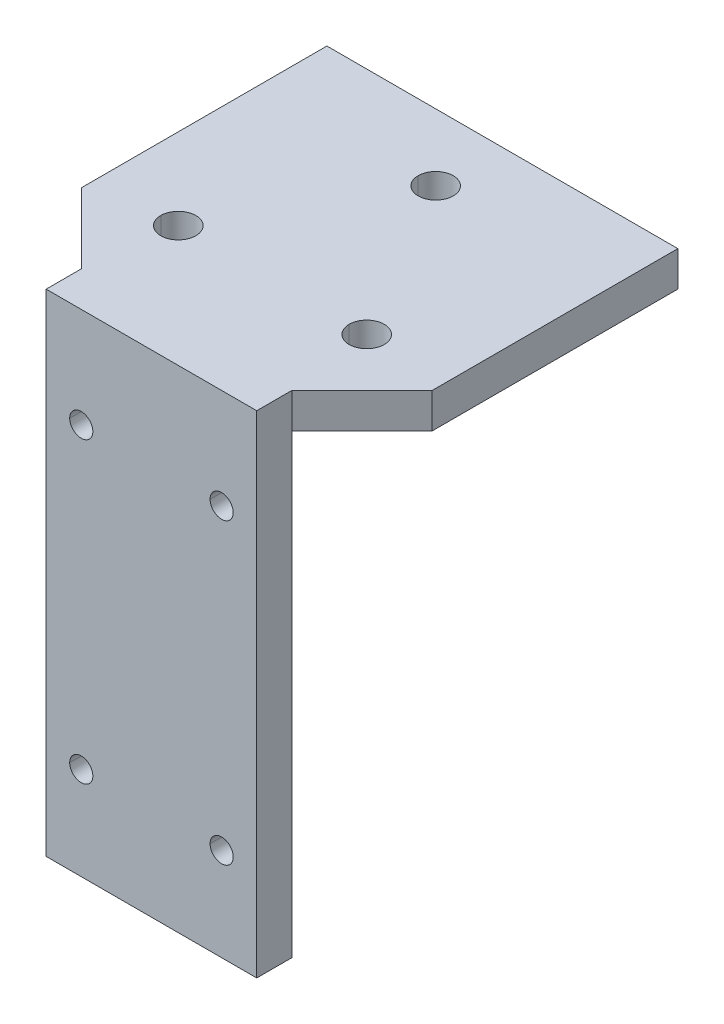
ISO-10303-21;
HEADER;
FILE_DESCRIPTION(('STEP AP214'),'2;1');
FILE_NAME('part.step','',(''),(''),'','','');
FILE_SCHEMA(('AUTOMOTIVE_DESIGN { 1 0 10303 214 1 1 1 1 }'));
ENDSEC;
DATA;
#1=APPLICATION_CONTEXT('core data for automotive mechanical design processes');
#2=APPLICATION_PROTOCOL_DEFINITION('international standard','automotive_design',2000,#1);
#3=PRODUCT_CONTEXT('',#1,'mechanical');
#4=PRODUCT('Part','Part','',(#3));
#5=PRODUCT_RELATED_PRODUCT_CATEGORY('part','',(#4));
#6=PRODUCT_DEFINITION_FORMATION('','',#4);
#7=PRODUCT_DEFINITION_CONTEXT('part definition',#1,'design');
#8=PRODUCT_DEFINITION('design','',#6,#7);
#9=PRODUCT_DEFINITION_SHAPE('','',#8);
#10=(LENGTH_UNIT() NAMED_UNIT(*) SI_UNIT(.MILLI.,.METRE.));
#11=(NAMED_UNIT(*) PLANE_ANGLE_UNIT() SI_UNIT($,.RADIAN.));
#12=(NAMED_UNIT(*) SI_UNIT($,.STERADIAN.) SOLID_ANGLE_UNIT());
#13=UNCERTAINTY_MEASURE_WITH_UNIT(LENGTH_MEASURE(1.E-05),#10,'distance_accuracy_value','');
#14=(GEOMETRIC_REPRESENTATION_CONTEXT(3) GLOBAL_UNCERTAINTY_ASSIGNED_CONTEXT((#13)) GLOBAL_UNIT_ASSIGNED_CONTEXT((#10,
#11,#12)) REPRESENTATION_CONTEXT('',''));
#15=CARTESIAN_POINT('',(0.,0.,0.));
#16=DIRECTION('',(0.,0.,1.));
#17=DIRECTION('',(1.,0.,0.));
#18=AXIS2_PLACEMENT_3D('',#15,#16,#17);
#19=CARTESIAN_POINT('',(0.,0.,0.));
#20=DIRECTION('',(0.,1.,0.));
#21=DIRECTION('',(1.,0.,0.));
#22=AXIS2_PLACEMENT_3D('',#19,#20,#21);
#23=PLANE('',#22);
#24=DIRECTION('',(-1.,0.,0.));
#25=VECTOR('',#24,1.);
#26=CARTESIAN_POINT('',(15.,0.,20.));
#27=LINE('',#26,#25);
#28=CARTESIAN_POINT('',(15.,0.,20.));
#29=VERTEX_POINT('',#28);
#30=CARTESIAN_POINT('',(-15.,0.,20.));
#31=VERTEX_POINT('',#30);
#32=EDGE_CURVE('E11',#29,#31,#27,.T.);
#33=ORIENTED_EDGE('',*,*,#32,.T.);
#34=DIRECTION('',(-0.707106781186548,0.,-0.707106781186548));
#35=VECTOR('',#34,1.);
#36=CARTESIAN_POINT('',(-15.,0.,20.));
#37=LINE('',#36,#35);
#38=CARTESIAN_POINT('',(-25.,0.,10.));
#39=VERTEX_POINT('',#38);
#40=EDGE_CURVE('E27',#31,#39,#37,.T.);
#41=ORIENTED_EDGE('',*,*,#40,.T.);
#42=DIRECTION('',(0.,0.,-1.));
#43=VECTOR('',#42,1.);
#44=CARTESIAN_POINT('',(-25.,0.,10.));
#45=LINE('',#44,#43);
#46=CARTESIAN_POINT('',(-25.,0.,-25.));
#47=VERTEX_POINT('',#46);
#48=EDGE_CURVE('E230',#39,#47,#45,.T.);
#49=ORIENTED_EDGE('',*,*,#48,.T.);
#50=DIRECTION('',(-1.,0.,0.));
#51=VECTOR('',#50,1.);
#52=CARTESIAN_POINT('',(25.,0.,-25.));
#53=LINE('',#52,#51);
#54=CARTESIAN_POINT('',(25.,0.,-25.));
#55=VERTEX_POINT('',#54);
#56=EDGE_CURVE('E296',#55,#47,#53,.T.);
#57=ORIENTED_EDGE('',*,*,#56,.F.);
#58=DIRECTION('',(0.,0.,1.));
#59=VECTOR('',#58,1.);
#60=CARTESIAN_POINT('',(25.,0.,-25.));
#61=LINE('',#60,#59);
#62=CARTESIAN_POINT('',(25.,0.,10.));
#63=VERTEX_POINT('',#62);
#64=EDGE_CURVE('E313',#55,#63,#61,.T.);
#65=ORIENTED_EDGE('',*,*,#64,.T.);
#66=DIRECTION('',(-0.707106781186548,0.,0.707106781186548));
#67=VECTOR('',#66,1.);
#68=CARTESIAN_POINT('',(25.,0.,10.));
#69=LINE('',#68,#67);
#70=EDGE_CURVE('E266',#63,#29,#69,.T.);
#71=ORIENTED_EDGE('',*,*,#70,.T.);
#72=EDGE_LOOP('',(#33,#41,#49,#57,#65,#71));
#73=FACE_BOUND('',#72,.T.);
#74=CARTESIAN_POINT('',(13.42339375866,0.,7.75));
#75=DIRECTION('',(0.,-1.,0.));
#76=DIRECTION('',(1.,0.,0.));
#77=AXIS2_PLACEMENT_3D('',#74,#75,#76);
#78=CIRCLE('',#77,2.5);
#79=CARTESIAN_POINT('',(15.92339375866,0.,7.75));
#80=VERTEX_POINT('',#79);
#81=CARTESIAN_POINT('',(10.92339375866,0.,7.75));
#82=VERTEX_POINT('',#81);
#83=EDGE_CURVE('E289',#80,#82,#78,.T.);
#84=ORIENTED_EDGE('',*,*,#83,.F.);
#85=CARTESIAN_POINT('',(13.42339375866,0.,7.75));
#86=DIRECTION('',(0.,-1.,0.));
#87=DIRECTION('',(-1.,0.,0.));
#88=AXIS2_PLACEMENT_3D('',#85,#86,#87);
#89=CIRCLE('',#88,2.5);
#90=EDGE_CURVE('E348',#82,#80,#89,.T.);
#91=ORIENTED_EDGE('',*,*,#90,.F.);
#92=EDGE_LOOP('',(#84,#91));
#93=FACE_BOUND('',#92,.T.);
#94=CARTESIAN_POINT('',(-13.42339375866,0.,7.75));
#95=DIRECTION('',(0.,-1.,0.));
#96=DIRECTION('',(1.,0.,0.));
#97=AXIS2_PLACEMENT_3D('',#94,#95,#96);
#98=CIRCLE('',#97,2.5);
#99=CARTESIAN_POINT('',(-10.92339375866,0.,7.75));
#100=VERTEX_POINT('',#99);
#101=CARTESIAN_POINT('',(-15.92339375866,0.,7.75));
#102=VERTEX_POINT('',#101);
#103=EDGE_CURVE('E288',#100,#102,#98,.T.);
#104=ORIENTED_EDGE('',*,*,#103,.F.);
#105=CARTESIAN_POINT('',(-13.42339375866,0.,7.75));
#106=DIRECTION('',(0.,-1.,0.));
#107=DIRECTION('',(-1.,0.,0.));
#108=AXIS2_PLACEMENT_3D('',#105,#106,#107);
#109=CIRCLE('',#108,2.5);
#110=EDGE_CURVE('E257',#102,#100,#109,.T.);
#111=ORIENTED_EDGE('',*,*,#110,.F.);
#112=EDGE_LOOP('',(#104,#111));
#113=FACE_BOUND('',#112,.T.);
#114=CARTESIAN_POINT('',(0.,0.,-15.5));
#115=DIRECTION('',(0.,-1.,0.));
#116=DIRECTION('',(1.,0.,0.));
#117=AXIS2_PLACEMENT_3D('',#114,#115,#116);
#118=CIRCLE('',#117,2.5);
#119=CARTESIAN_POINT('',(2.5,0.,-15.5));
#120=VERTEX_POINT('',#119);
#121=CARTESIAN_POINT('',(-2.5,0.,-15.5));
#122=VERTEX_POINT('',#121);
#123=EDGE_CURVE('E306',#120,#122,#118,.T.);
#124=ORIENTED_EDGE('',*,*,#123,.F.);
#125=CARTESIAN_POINT('',(0.,0.,-15.5));
#126=DIRECTION('',(0.,-1.,0.));
#127=DIRECTION('',(-1.,0.,0.));
#128=AXIS2_PLACEMENT_3D('',#125,#126,#127);
#129=CIRCLE('',#128,2.5);
#130=EDGE_CURVE('E247',#122,#120,#129,.T.);
#131=ORIENTED_EDGE('',*,*,#130,.F.);
#132=EDGE_LOOP('',(#124,#131));
#133=FACE_BOUND('',#132,.T.);
#134=ADVANCED_FACE('F16',(#73,#93,#113,#133),#23,.F.);
#135=CARTESIAN_POINT('',(0.,5.775,-15.5));
#136=DIRECTION('',(0.,-1.,0.));
#137=DIRECTION('',(-1.,0.,0.));
#138=AXIS2_PLACEMENT_3D('',#135,#136,#137);
#139=CYLINDRICAL_SURFACE('',#138,2.5);
#140=DIRECTION('',(0.,-1.,0.));
#141=VECTOR('',#140,1.);
#142=CARTESIAN_POINT('',(2.5,5.,-15.5));
#143=LINE('',#142,#141);
#144=CARTESIAN_POINT('',(2.5,5.,-15.5));
#145=VERTEX_POINT('',#144);
#146=EDGE_CURVE('E251',#145,#120,#143,.T.);
#147=ORIENTED_EDGE('',*,*,#146,.F.);
#148=CARTESIAN_POINT('',(0.,5.,-15.5));
#149=DIRECTION('',(0.,-1.,0.));
#150=DIRECTION('',(-1.,0.,0.));
#151=AXIS2_PLACEMENT_3D('',#148,#149,#150);
#152=CIRCLE('',#151,2.5);
#153=CARTESIAN_POINT('',(-2.5,5.,-15.5));
#154=VERTEX_POINT('',#153);
#155=EDGE_CURVE('E334',#154,#145,#152,.T.);
#156=ORIENTED_EDGE('',*,*,#155,.F.);
#157=DIRECTION('',(0.,-1.,0.));
#158=VECTOR('',#157,1.);
#159=CARTESIAN_POINT('',(-2.5,5.,-15.5));
#160=LINE('',#159,#158);
#161=EDGE_CURVE('E250',#154,#122,#160,.T.);
#162=ORIENTED_EDGE('',*,*,#161,.T.);
#163=ORIENTED_EDGE('',*,*,#130,.T.);
#164=EDGE_LOOP('',(#147,#156,#162,#163));
#165=FACE_BOUND('',#164,.T.);
#166=ADVANCED_FACE('F505',(#165),#139,.F.);
#167=CARTESIAN_POINT('',(0.,5.775,-15.5));
#168=DIRECTION('',(0.,-1.,0.));
#169=DIRECTION('',(-1.,0.,0.));
#170=AXIS2_PLACEMENT_3D('',#167,#168,#169);
#171=CYLINDRICAL_SURFACE('',#170,2.5);
#172=ORIENTED_EDGE('',*,*,#161,.F.);
#173=CARTESIAN_POINT('',(0.,5.,-15.5));
#174=DIRECTION('',(0.,-1.,0.));
#175=DIRECTION('',(1.,0.,0.));
#176=AXIS2_PLACEMENT_3D('',#173,#174,#175);
#177=CIRCLE('',#176,2.5);
#178=EDGE_CURVE('E283',#145,#154,#177,.T.);
#179=ORIENTED_EDGE('',*,*,#178,.F.);
#180=ORIENTED_EDGE('',*,*,#146,.T.);
#181=ORIENTED_EDGE('',*,*,#123,.T.);
#182=EDGE_LOOP('',(#172,#179,#180,#181));
#183=FACE_BOUND('',#182,.T.);
#184=ADVANCED_FACE('F511',(#183),#171,.F.);
#185=CARTESIAN_POINT('',(0.,5.,0.));
#186=DIRECTION('',(0.,1.,0.));
#187=DIRECTION('',(1.,0.,0.));
#188=AXIS2_PLACEMENT_3D('',#185,#186,#187);
#189=PLANE('',#188);
#190=DIRECTION('',(0.,0.,-1.));
#191=VECTOR('',#190,1.);
#192=CARTESIAN_POINT('',(25.,5.,10.));
#193=LINE('',#192,#191);
#194=CARTESIAN_POINT('',(25.,5.,10.));
#195=VERTEX_POINT('',#194);
#196=CARTESIAN_POINT('',(25.,5.,-25.));
#197=VERTEX_POINT('',#196);
#198=EDGE_CURVE('E310',#195,#197,#193,.T.);
#199=ORIENTED_EDGE('',*,*,#198,.T.);
#200=DIRECTION('',(-1.,0.,0.));
#201=VECTOR('',#200,1.);
#202=CARTESIAN_POINT('',(25.,5.,-25.));
#203=LINE('',#202,#201);
#204=CARTESIAN_POINT('',(-25.,5.,-25.));
#205=VERTEX_POINT('',#204);
#206=EDGE_CURVE('E222',#197,#205,#203,.T.);
#207=ORIENTED_EDGE('',*,*,#206,.T.);
#208=DIRECTION('',(0.,0.,1.));
#209=VECTOR('',#208,1.);
#210=CARTESIAN_POINT('',(-25.,5.,-25.));
#211=LINE('',#210,#209);
#212=CARTESIAN_POINT('',(-25.,5.,10.));
#213=VERTEX_POINT('',#212);
#214=EDGE_CURVE('E214',#205,#213,#211,.T.);
#215=ORIENTED_EDGE('',*,*,#214,.T.);
#216=DIRECTION('',(0.707106781186548,0.,0.707106781186548));
#217=VECTOR('',#216,1.);
#218=CARTESIAN_POINT('',(-25.,5.,10.));
#219=LINE('',#218,#217);
#220=CARTESIAN_POINT('',(-15.,5.,20.));
#221=VERTEX_POINT('',#220);
#222=EDGE_CURVE('E205',#213,#221,#219,.T.);
#223=ORIENTED_EDGE('',*,*,#222,.T.);
#224=DIRECTION('',(0.,0.,1.));
#225=VECTOR('',#224,1.);
#226=CARTESIAN_POINT('',(-15.,5.,20.));
#227=LINE('',#226,#225);
#228=CARTESIAN_POINT('',(-15.,5.,25.));
#229=VERTEX_POINT('',#228);
#230=EDGE_CURVE('E215',#221,#229,#227,.T.);
#231=ORIENTED_EDGE('',*,*,#230,.T.);
#232=DIRECTION('',(1.,0.,0.));
#233=VECTOR('',#232,1.);
#234=CARTESIAN_POINT('',(-15.,5.,25.));
#235=LINE('',#234,#233);
#236=CARTESIAN_POINT('',(15.,5.,25.));
#237=VERTEX_POINT('',#236);
#238=EDGE_CURVE('E245',#229,#237,#235,.T.);
#239=ORIENTED_EDGE('',*,*,#238,.T.);
#240=DIRECTION('',(0.,0.,-1.));
#241=VECTOR('',#240,1.);
#242=CARTESIAN_POINT('',(15.,5.,25.));
#243=LINE('',#242,#241);
#244=CARTESIAN_POINT('',(15.,5.,20.));
#245=VERTEX_POINT('',#244);
#246=EDGE_CURVE('E324',#237,#245,#243,.T.);
#247=ORIENTED_EDGE('',*,*,#246,.T.);
#248=DIRECTION('',(0.707106781186548,0.,-0.707106781186548));
#249=VECTOR('',#248,1.);
#250=CARTESIAN_POINT('',(15.,5.,20.));
#251=LINE('',#250,#249);
#252=EDGE_CURVE('E328',#245,#195,#251,.T.);
#253=ORIENTED_EDGE('',*,*,#252,.T.);
#254=EDGE_LOOP('',(#199,#207,#215,#223,#231,#239,#247,#253));
#255=FACE_BOUND('',#254,.T.);
#256=CARTESIAN_POINT('',(13.42339375866,5.,7.75));
#257=DIRECTION('',(0.,-1.,0.));
#258=DIRECTION('',(1.,0.,0.));
#259=AXIS2_PLACEMENT_3D('',#256,#257,#258);
#260=CIRCLE('',#259,2.5);
#261=CARTESIAN_POINT('',(15.92339375866,5.,7.75));
#262=VERTEX_POINT('',#261);
#263=CARTESIAN_POINT('',(10.92339375866,5.,7.75));
#264=VERTEX_POINT('',#263);
#265=EDGE_CURVE('E361',#262,#264,#260,.T.);
#266=ORIENTED_EDGE('',*,*,#265,.T.);
#267=CARTESIAN_POINT('',(13.42339375866,5.,7.75));
#268=DIRECTION('',(0.,-1.,0.));
#269=DIRECTION('',(-1.,0.,0.));
#270=AXIS2_PLACEMENT_3D('',#267,#268,#269);
#271=CIRCLE('',#270,2.5);
#272=EDGE_CURVE('E365',#264,#262,#271,.T.);
#273=ORIENTED_EDGE('',*,*,#272,.T.);
#274=EDGE_LOOP('',(#266,#273));
#275=FACE_BOUND('',#274,.T.);
#276=CARTESIAN_POINT('',(-13.42339375866,5.,7.75));
#277=DIRECTION('',(0.,-1.,0.));
#278=DIRECTION('',(1.,0.,0.));
#279=AXIS2_PLACEMENT_3D('',#276,#277,#278);
#280=CIRCLE('',#279,2.5);
#281=CARTESIAN_POINT('',(-10.92339375866,5.,7.75));
#282=VERTEX_POINT('',#281);
#283=CARTESIAN_POINT('',(-15.92339375866,5.,7.75));
#284=VERTEX_POINT('',#283);
#285=EDGE_CURVE('E282',#282,#284,#280,.T.);
#286=ORIENTED_EDGE('',*,*,#285,.T.);
#287=CARTESIAN_POINT('',(-13.42339375866,5.,7.75));
#288=DIRECTION('',(0.,-1.,0.));
#289=DIRECTION('',(-1.,0.,0.));
#290=AXIS2_PLACEMENT_3D('',#287,#288,#289);
#291=CIRCLE('',#290,2.5);
#292=EDGE_CURVE('E279',#284,#282,#291,.T.);
#293=ORIENTED_EDGE('',*,*,#292,.T.);
#294=EDGE_LOOP('',(#286,#293));
#295=FACE_BOUND('',#294,.T.);
#296=ORIENTED_EDGE('',*,*,#178,.T.);
#297=ORIENTED_EDGE('',*,*,#155,.T.);
#298=EDGE_LOOP('',(#296,#297));
#299=FACE_BOUND('',#298,.T.);
#300=ADVANCED_FACE('F219',(#255,#275,#295,#299),#189,.T.);
#301=CARTESIAN_POINT('',(13.42339375866,5.775,7.75));
#302=DIRECTION('',(0.,-1.,0.));
#303=DIRECTION('',(-1.,0.,0.));
#304=AXIS2_PLACEMENT_3D('',#301,#302,#303);
#305=CYLINDRICAL_SURFACE('',#304,2.5);
#306=DIRECTION('',(0.,-1.,0.));
#307=VECTOR('',#306,1.);
#308=CARTESIAN_POINT('',(15.92339375866,5.,7.75));
#309=LINE('',#308,#307);
#310=EDGE_CURVE('E292',#262,#80,#309,.T.);
#311=ORIENTED_EDGE('',*,*,#310,.F.);
#312=ORIENTED_EDGE('',*,*,#272,.F.);
#313=DIRECTION('',(0.,-1.,0.));
#314=VECTOR('',#313,1.);
#315=CARTESIAN_POINT('',(10.92339375866,5.,7.75));
#316=LINE('',#315,#314);
#317=EDGE_CURVE('E337',#264,#82,#316,.T.);
#318=ORIENTED_EDGE('',*,*,#317,.T.);
#319=ORIENTED_EDGE('',*,*,#90,.T.);
#320=EDGE_LOOP('',(#311,#312,#318,#319));
#321=FACE_BOUND('',#320,.T.);
#322=ADVANCED_FACE('F529',(#321),#305,.F.);
#323=CARTESIAN_POINT('',(13.42339375866,5.775,7.75));
#324=DIRECTION('',(0.,-1.,0.));
#325=DIRECTION('',(-1.,0.,0.));
#326=AXIS2_PLACEMENT_3D('',#323,#324,#325);
#327=CYLINDRICAL_SURFACE('',#326,2.5);
#328=ORIENTED_EDGE('',*,*,#317,.F.);
#329=ORIENTED_EDGE('',*,*,#265,.F.);
#330=ORIENTED_EDGE('',*,*,#310,.T.);
#331=ORIENTED_EDGE('',*,*,#83,.T.);
#332=EDGE_LOOP('',(#328,#329,#330,#331));
#333=FACE_BOUND('',#332,.T.);
#334=ADVANCED_FACE('F523',(#333),#327,.F.);
#335=CARTESIAN_POINT('',(-13.42339375866,5.775,7.75));
#336=DIRECTION('',(0.,-1.,0.));
#337=DIRECTION('',(-1.,0.,0.));
#338=AXIS2_PLACEMENT_3D('',#335,#336,#337);
#339=CYLINDRICAL_SURFACE('',#338,2.5);
#340=DIRECTION('',(0.,-1.,0.));
#341=VECTOR('',#340,1.);
#342=CARTESIAN_POINT('',(-10.92339375866,5.,7.75));
#343=LINE('',#342,#341);
#344=EDGE_CURVE('E262',#282,#100,#343,.T.);
#345=ORIENTED_EDGE('',*,*,#344,.F.);
#346=ORIENTED_EDGE('',*,*,#292,.F.);
#347=DIRECTION('',(0.,-1.,0.));
#348=VECTOR('',#347,1.);
#349=CARTESIAN_POINT('',(-15.92339375866,5.,7.75));
#350=LINE('',#349,#348);
#351=EDGE_CURVE('E261',#284,#102,#350,.T.);
#352=ORIENTED_EDGE('',*,*,#351,.T.);
#353=ORIENTED_EDGE('',*,*,#110,.T.);
#354=EDGE_LOOP('',(#345,#346,#352,#353));
#355=FACE_BOUND('',#354,.T.);
#356=ADVANCED_FACE('F520',(#355),#339,.F.);
#357=CARTESIAN_POINT('',(-13.42339375866,5.775,7.75));
#358=DIRECTION('',(0.,-1.,0.));
#359=DIRECTION('',(-1.,0.,0.));
#360=AXIS2_PLACEMENT_3D('',#357,#358,#359);
#361=CYLINDRICAL_SURFACE('',#360,2.5);
#362=ORIENTED_EDGE('',*,*,#351,.F.);
#363=ORIENTED_EDGE('',*,*,#285,.F.);
#364=ORIENTED_EDGE('',*,*,#344,.T.);
#365=ORIENTED_EDGE('',*,*,#103,.T.);
#366=EDGE_LOOP('',(#362,#363,#364,#365));
#367=FACE_BOUND('',#366,.T.);
#368=ADVANCED_FACE('F18',(#367),#361,.F.);
#369=CARTESIAN_POINT('',(20.,2.5,15.));
#370=DIRECTION('',(0.707106781186548,0.,0.707106781186548));
#371=DIRECTION('',(0.,-1.,0.));
#372=AXIS2_PLACEMENT_3D('',#369,#370,#371);
#373=PLANE('',#372);
#374=ORIENTED_EDGE('',*,*,#70,.F.);
#375=DIRECTION('',(0.,-1.,0.));
#376=VECTOR('',#375,1.);
#377=CARTESIAN_POINT('',(25.,5.,10.));
#378=LINE('',#377,#376);
#379=EDGE_CURVE('E277',#195,#63,#378,.T.);
#380=ORIENTED_EDGE('',*,*,#379,.F.);
#381=ORIENTED_EDGE('',*,*,#252,.F.);
#382=DIRECTION('',(0.,1.,0.));
#383=VECTOR('',#382,1.);
#384=CARTESIAN_POINT('',(15.,0.,20.));
#385=LINE('',#384,#383);
#386=EDGE_CURVE('E252',#29,#245,#385,.T.);
#387=ORIENTED_EDGE('',*,*,#386,.F.);
#388=EDGE_LOOP('',(#374,#380,#381,#387));
#389=FACE_BOUND('',#388,.T.);
#390=ADVANCED_FACE('F531',(#389),#373,.T.);
#391=CARTESIAN_POINT('',(15.,5.,25.));
#392=DIRECTION('',(1.,0.,0.));
#393=DIRECTION('',(0.,1.,0.));
#394=AXIS2_PLACEMENT_3D('',#391,#392,#393);
#395=PLANE('',#394);
#396=ORIENTED_EDGE('',*,*,#246,.F.);
#397=DIRECTION('',(0.,-1.,0.));
#398=VECTOR('',#397,1.);
#399=CARTESIAN_POINT('',(15.,5.,25.));
#400=LINE('',#399,#398);
#401=CARTESIAN_POINT('',(15.,-65.,25.));
#402=VERTEX_POINT('',#401);
#403=EDGE_CURVE('E284',#237,#402,#400,.T.);
#404=ORIENTED_EDGE('',*,*,#403,.T.);
#405=DIRECTION('',(0.,0.,-1.));
#406=VECTOR('',#405,1.);
#407=CARTESIAN_POINT('',(15.,-65.,25.));
#408=LINE('',#407,#406);
#409=CARTESIAN_POINT('',(15.,-65.,20.));
#410=VERTEX_POINT('',#409);
#411=EDGE_CURVE('E256',#402,#410,#408,.T.);
#412=ORIENTED_EDGE('',*,*,#411,.T.);
#413=DIRECTION('',(0.,-1.,0.));
#414=VECTOR('',#413,1.);
#415=CARTESIAN_POINT('',(15.,0.,20.));
#416=LINE('',#415,#414);
#417=EDGE_CURVE('E116',#29,#410,#416,.T.);
#418=ORIENTED_EDGE('',*,*,#417,.F.);
#419=ORIENTED_EDGE('',*,*,#386,.T.);
#420=EDGE_LOOP('',(#396,#404,#412,#418,#419));
#421=FACE_BOUND('',#420,.T.);
#422=ADVANCED_FACE('F471',(#421),#395,.T.);
#423=CARTESIAN_POINT('',(15.,5.,20.));
#424=DIRECTION('',(0.,0.,-1.));
#425=DIRECTION('',(0.,-1.,0.));
#426=AXIS2_PLACEMENT_3D('',#423,#424,#425);
#427=PLANE('',#426);
#428=ORIENTED_EDGE('',*,*,#417,.T.);
#429=DIRECTION('',(-1.,0.,0.));
#430=VECTOR('',#429,1.);
#431=CARTESIAN_POINT('',(15.,-65.,20.));
#432=LINE('',#431,#430);
#433=CARTESIAN_POINT('',(-15.,-65.,20.));
#434=VERTEX_POINT('',#433);
#435=EDGE_CURVE('E350',#410,#434,#432,.T.);
#436=ORIENTED_EDGE('',*,*,#435,.T.);
#437=DIRECTION('',(0.,-1.,0.));
#438=VECTOR('',#437,1.);
#439=CARTESIAN_POINT('',(-15.,0.,20.));
#440=LINE('',#439,#438);
#441=EDGE_CURVE('E41',#31,#434,#440,.T.);
#442=ORIENTED_EDGE('',*,*,#441,.F.);
#443=ORIENTED_EDGE('',*,*,#32,.F.);
#444=EDGE_LOOP('',(#428,#436,#442,#443));
#445=FACE_BOUND('',#444,.T.);
#446=CARTESIAN_POINT('',(-10.,-51.75,20.));
#447=DIRECTION('',(0.,0.,-1.));
#448=DIRECTION('',(-1.,0.,0.));
#449=AXIS2_PLACEMENT_3D('',#446,#447,#448);
#450=CIRCLE('',#449,1.65);
#451=CARTESIAN_POINT('',(-11.65,-51.75,20.));
#452=VERTEX_POINT('',#451);
#453=CARTESIAN_POINT('',(-8.35,-51.75,20.));
#454=VERTEX_POINT('',#453);
#455=EDGE_CURVE('E385',#452,#454,#450,.T.);
#456=ORIENTED_EDGE('',*,*,#455,.F.);
#457=CARTESIAN_POINT('',(-10.,-51.75,20.));
#458=DIRECTION('',(0.,0.,-1.));
#459=DIRECTION('',(1.,0.,0.));
#460=AXIS2_PLACEMENT_3D('',#457,#458,#459);
#461=CIRCLE('',#460,1.65);
#462=EDGE_CURVE('E384',#454,#452,#461,.T.);
#463=ORIENTED_EDGE('',*,*,#462,.F.);
#464=EDGE_LOOP('',(#456,#463));
#465=FACE_BOUND('',#464,.T.);
#466=CARTESIAN_POINT('',(10.,-51.75,20.));
#467=DIRECTION('',(0.,0.,-1.));
#468=DIRECTION('',(-1.,0.,0.));
#469=AXIS2_PLACEMENT_3D('',#466,#467,#468);
#470=CIRCLE('',#469,1.65);
#471=CARTESIAN_POINT('',(8.35,-51.75,20.));
#472=VERTEX_POINT('',#471);
#473=CARTESIAN_POINT('',(11.65,-51.75,20.));
#474=VERTEX_POINT('',#473);
#475=EDGE_CURVE('E271',#472,#474,#470,.T.);
#476=ORIENTED_EDGE('',*,*,#475,.F.);
#477=CARTESIAN_POINT('',(10.,-51.75,20.));
#478=DIRECTION('',(0.,0.,-1.));
#479=DIRECTION('',(1.,0.,0.));
#480=AXIS2_PLACEMENT_3D('',#477,#478,#479);
#481=CIRCLE('',#480,1.65);
#482=EDGE_CURVE('E333',#474,#472,#481,.T.);
#483=ORIENTED_EDGE('',*,*,#482,.F.);
#484=EDGE_LOOP('',(#476,#483));
#485=FACE_BOUND('',#484,.T.);
#486=CARTESIAN_POINT('',(-10.,-9.25,20.));
#487=DIRECTION('',(0.,0.,-1.));
#488=DIRECTION('',(-1.,0.,0.));
#489=AXIS2_PLACEMENT_3D('',#486,#487,#488);
#490=CIRCLE('',#489,1.65);
#491=CARTESIAN_POINT('',(-11.65,-9.25,20.));
#492=VERTEX_POINT('',#491);
#493=CARTESIAN_POINT('',(-8.35,-9.25,20.));
#494=VERTEX_POINT('',#493);
#495=EDGE_CURVE('E366',#492,#494,#490,.T.);
#496=ORIENTED_EDGE('',*,*,#495,.F.);
#497=CARTESIAN_POINT('',(-10.,-9.25,20.));
#498=DIRECTION('',(0.,0.,-1.));
#499=DIRECTION('',(1.,0.,0.));
#500=AXIS2_PLACEMENT_3D('',#497,#498,#499);
#501=CIRCLE('',#500,1.65);
#502=EDGE_CURVE('E272',#494,#492,#501,.T.);
#503=ORIENTED_EDGE('',*,*,#502,.F.);
#504=EDGE_LOOP('',(#496,#503));
#505=FACE_BOUND('',#504,.T.);
#506=CARTESIAN_POINT('',(10.,-9.25,20.));
#507=DIRECTION('',(0.,0.,-1.));
#508=DIRECTION('',(-1.,0.,0.));
#509=AXIS2_PLACEMENT_3D('',#506,#507,#508);
#510=CIRCLE('',#509,1.65);
#511=CARTESIAN_POINT('',(8.35,-9.25,20.));
#512=VERTEX_POINT('',#511);
#513=CARTESIAN_POINT('',(11.65,-9.25,20.));
#514=VERTEX_POINT('',#513);
#515=EDGE_CURVE('E319',#512,#514,#510,.T.);
#516=ORIENTED_EDGE('',*,*,#515,.F.);
#517=CARTESIAN_POINT('',(10.,-9.25,20.));
#518=DIRECTION('',(0.,0.,-1.));
#519=DIRECTION('',(1.,0.,0.));
#520=AXIS2_PLACEMENT_3D('',#517,#518,#519);
#521=CIRCLE('',#520,1.65);
#522=EDGE_CURVE('E318',#514,#512,#521,.T.);
#523=ORIENTED_EDGE('',*,*,#522,.F.);
#524=EDGE_LOOP('',(#516,#523));
#525=FACE_BOUND('',#524,.T.);
#526=ADVANCED_FACE('F467',(#445,#465,#485,#505,#525),#427,.T.);
#527=CARTESIAN_POINT('',(-15.,5.,20.));
#528=DIRECTION('',(-1.,0.,0.));
#529=DIRECTION('',(0.,0.,1.));
#530=AXIS2_PLACEMENT_3D('',#527,#528,#529);
#531=PLANE('',#530);
#532=ORIENTED_EDGE('',*,*,#441,.T.);
#533=DIRECTION('',(0.,0.,1.));
#534=VECTOR('',#533,1.);
#535=CARTESIAN_POINT('',(-15.,-65.,20.));
#536=LINE('',#535,#534);
#537=CARTESIAN_POINT('',(-15.,-65.,25.));
#538=VERTEX_POINT('',#537);
#539=EDGE_CURVE('E233',#434,#538,#536,.T.);
#540=ORIENTED_EDGE('',*,*,#539,.T.);
#541=DIRECTION('',(0.,-1.,0.));
#542=VECTOR('',#541,1.);
#543=CARTESIAN_POINT('',(-15.,5.,25.));
#544=LINE('',#543,#542);
#545=EDGE_CURVE('E278',#229,#538,#544,.T.);
#546=ORIENTED_EDGE('',*,*,#545,.F.);
#547=ORIENTED_EDGE('',*,*,#230,.F.);
#548=DIRECTION('',(0.,1.,0.));
#549=VECTOR('',#548,1.);
#550=CARTESIAN_POINT('',(-15.,0.,20.));
#551=LINE('',#550,#549);
#552=EDGE_CURVE('E210',#31,#221,#551,.T.);
#553=ORIENTED_EDGE('',*,*,#552,.F.);
#554=EDGE_LOOP('',(#532,#540,#546,#547,#553));
#555=FACE_BOUND('',#554,.T.);
#556=ADVANCED_FACE('F470',(#555),#531,.T.);
#557=CARTESIAN_POINT('',(-20.,2.5,15.));
#558=DIRECTION('',(-0.707106781186548,0.,0.707106781186548));
#559=DIRECTION('',(0.,1.,0.));
#560=AXIS2_PLACEMENT_3D('',#557,#558,#559);
#561=PLANE('',#560);
#562=ORIENTED_EDGE('',*,*,#222,.F.);
#563=DIRECTION('',(0.,-1.,0.));
#564=VECTOR('',#563,1.);
#565=CARTESIAN_POINT('',(-25.,5.,10.));
#566=LINE('',#565,#564);
#567=EDGE_CURVE('E209',#213,#39,#566,.T.);
#568=ORIENTED_EDGE('',*,*,#567,.T.);
#569=ORIENTED_EDGE('',*,*,#40,.F.);
#570=ORIENTED_EDGE('',*,*,#552,.T.);
#571=EDGE_LOOP('',(#562,#568,#569,#570));
#572=FACE_BOUND('',#571,.T.);
#573=ADVANCED_FACE('F207',(#572),#561,.T.);
#574=CARTESIAN_POINT('',(-25.,0.,-20.));
#575=DIRECTION('',(-1.,0.,0.));
#576=DIRECTION('',(0.,0.,1.));
#577=AXIS2_PLACEMENT_3D('',#574,#575,#576);
#578=PLANE('',#577);
#579=ORIENTED_EDGE('',*,*,#567,.F.);
#580=ORIENTED_EDGE('',*,*,#214,.F.);
#581=DIRECTION('',(0.,1.,0.));
#582=VECTOR('',#581,1.);
#583=CARTESIAN_POINT('',(-25.,0.,-25.));
#584=LINE('',#583,#582);
#585=EDGE_CURVE('E241',#47,#205,#584,.T.);
#586=ORIENTED_EDGE('',*,*,#585,.F.);
#587=ORIENTED_EDGE('',*,*,#48,.F.);
#588=EDGE_LOOP('',(#579,#580,#586,#587));
#589=FACE_BOUND('',#588,.T.);
#590=ADVANCED_FACE('F228',(#589),#578,.T.);
#591=CARTESIAN_POINT('',(25.,0.,-25.));
#592=DIRECTION('',(0.,0.,-1.));
#593=DIRECTION('',(0.,-1.,0.));
#594=AXIS2_PLACEMENT_3D('',#591,#592,#593);
#595=PLANE('',#594);
#596=ORIENTED_EDGE('',*,*,#585,.T.);
#597=ORIENTED_EDGE('',*,*,#206,.F.);
#598=DIRECTION('',(0.,1.,0.));
#599=VECTOR('',#598,1.);
#600=CARTESIAN_POINT('',(25.,0.,-25.));
#601=LINE('',#600,#599);
#602=EDGE_CURVE('E273',#55,#197,#601,.T.);
#603=ORIENTED_EDGE('',*,*,#602,.F.);
#604=ORIENTED_EDGE('',*,*,#56,.T.);
#605=EDGE_LOOP('',(#596,#597,#603,#604));
#606=FACE_BOUND('',#605,.T.);
#607=ADVANCED_FACE('F498',(#606),#595,.T.);
#608=CARTESIAN_POINT('',(25.,0.,20.));
#609=DIRECTION('',(1.,0.,0.));
#610=DIRECTION('',(0.,1.,0.));
#611=AXIS2_PLACEMENT_3D('',#608,#609,#610);
#612=PLANE('',#611);
#613=ORIENTED_EDGE('',*,*,#379,.T.);
#614=ORIENTED_EDGE('',*,*,#64,.F.);
#615=ORIENTED_EDGE('',*,*,#602,.T.);
#616=ORIENTED_EDGE('',*,*,#198,.F.);
#617=EDGE_LOOP('',(#613,#614,#615,#616));
#618=FACE_BOUND('',#617,.T.);
#619=ADVANCED_FACE('F487',(#618),#612,.T.);
#620=CARTESIAN_POINT('',(-15.,5.,25.));
#621=DIRECTION('',(0.,0.,1.));
#622=DIRECTION('',(1.,0.,0.));
#623=AXIS2_PLACEMENT_3D('',#620,#621,#622);
#624=PLANE('',#623);
#625=ORIENTED_EDGE('',*,*,#545,.T.);
#626=DIRECTION('',(1.,0.,0.));
#627=VECTOR('',#626,1.);
#628=CARTESIAN_POINT('',(-15.,-65.,25.));
#629=LINE('',#628,#627);
#630=EDGE_CURVE('E301',#538,#402,#629,.T.);
#631=ORIENTED_EDGE('',*,*,#630,.T.);
#632=ORIENTED_EDGE('',*,*,#403,.F.);
#633=ORIENTED_EDGE('',*,*,#238,.F.);
#634=EDGE_LOOP('',(#625,#631,#632,#633));
#635=FACE_BOUND('',#634,.T.);
#636=CARTESIAN_POINT('',(-10.,-51.75,25.));
#637=DIRECTION('',(0.,0.,-1.));
#638=DIRECTION('',(-1.,0.,0.));
#639=AXIS2_PLACEMENT_3D('',#636,#637,#638);
#640=CIRCLE('',#639,1.65);
#641=CARTESIAN_POINT('',(-11.65,-51.75,25.));
#642=VERTEX_POINT('',#641);
#643=CARTESIAN_POINT('',(-8.35,-51.75,25.));
#644=VERTEX_POINT('',#643);
#645=EDGE_CURVE('E305',#642,#644,#640,.T.);
#646=ORIENTED_EDGE('',*,*,#645,.T.);
#647=CARTESIAN_POINT('',(-10.,-51.75,25.));
#648=DIRECTION('',(0.,0.,-1.));
#649=DIRECTION('',(1.,0.,0.));
#650=AXIS2_PLACEMENT_3D('',#647,#648,#649);
#651=CIRCLE('',#650,1.65);
#652=EDGE_CURVE('E320',#644,#642,#651,.T.);
#653=ORIENTED_EDGE('',*,*,#652,.T.);
#654=EDGE_LOOP('',(#646,#653));
#655=FACE_BOUND('',#654,.T.);
#656=CARTESIAN_POINT('',(10.,-51.75,25.));
#657=DIRECTION('',(0.,0.,-1.));
#658=DIRECTION('',(-1.,0.,0.));
#659=AXIS2_PLACEMENT_3D('',#656,#657,#658);
#660=CIRCLE('',#659,1.65);
#661=CARTESIAN_POINT('',(8.35,-51.75,25.));
#662=VERTEX_POINT('',#661);
#663=CARTESIAN_POINT('',(11.65,-51.75,25.));
#664=VERTEX_POINT('',#663);
#665=EDGE_CURVE('E323',#662,#664,#660,.T.);
#666=ORIENTED_EDGE('',*,*,#665,.T.);
#667=CARTESIAN_POINT('',(10.,-51.75,25.));
#668=DIRECTION('',(0.,0.,-1.));
#669=DIRECTION('',(1.,0.,0.));
#670=AXIS2_PLACEMENT_3D('',#667,#668,#669);
#671=CIRCLE('',#670,1.65);
#672=EDGE_CURVE('E408',#664,#662,#671,.T.);
#673=ORIENTED_EDGE('',*,*,#672,.T.);
#674=EDGE_LOOP('',(#666,#673));
#675=FACE_BOUND('',#674,.T.);
#676=CARTESIAN_POINT('',(-10.,-9.25,25.));
#677=DIRECTION('',(0.,0.,-1.));
#678=DIRECTION('',(-1.,0.,0.));
#679=AXIS2_PLACEMENT_3D('',#676,#677,#678);
#680=CIRCLE('',#679,1.65);
#681=CARTESIAN_POINT('',(-11.65,-9.25,25.));
#682=VERTEX_POINT('',#681);
#683=CARTESIAN_POINT('',(-8.35,-9.25,25.));
#684=VERTEX_POINT('',#683);
#685=EDGE_CURVE('E414',#682,#684,#680,.T.);
#686=ORIENTED_EDGE('',*,*,#685,.T.);
#687=CARTESIAN_POINT('',(-10.,-9.25,25.));
#688=DIRECTION('',(0.,0.,-1.));
#689=DIRECTION('',(1.,0.,0.));
#690=AXIS2_PLACEMENT_3D('',#687,#688,#689);
#691=CIRCLE('',#690,1.65);
#692=EDGE_CURVE('E359',#684,#682,#691,.T.);
#693=ORIENTED_EDGE('',*,*,#692,.T.);
#694=EDGE_LOOP('',(#686,#693));
#695=FACE_BOUND('',#694,.T.);
#696=CARTESIAN_POINT('',(10.,-9.25,25.));
#697=DIRECTION('',(0.,0.,-1.));
#698=DIRECTION('',(-1.,0.,0.));
#699=AXIS2_PLACEMENT_3D('',#696,#697,#698);
#700=CIRCLE('',#699,1.65);
#701=CARTESIAN_POINT('',(8.35,-9.25,25.));
#702=VERTEX_POINT('',#701);
#703=CARTESIAN_POINT('',(11.65,-9.25,25.));
#704=VERTEX_POINT('',#703);
#705=EDGE_CURVE('E355',#702,#704,#700,.T.);
#706=ORIENTED_EDGE('',*,*,#705,.T.);
#707=CARTESIAN_POINT('',(10.,-9.25,25.));
#708=DIRECTION('',(0.,0.,-1.));
#709=DIRECTION('',(1.,0.,0.));
#710=AXIS2_PLACEMENT_3D('',#707,#708,#709);
#711=CIRCLE('',#710,1.65);
#712=EDGE_CURVE('E360',#704,#702,#711,.T.);
#713=ORIENTED_EDGE('',*,*,#712,.T.);
#714=EDGE_LOOP('',(#706,#713));
#715=FACE_BOUND('',#714,.T.);
#716=ADVANCED_FACE('F484',(#635,#655,#675,#695,#715),#624,.T.);
#717=CARTESIAN_POINT('',(0.,-65.,0.));
#718=DIRECTION('',(0.,1.,0.));
#719=DIRECTION('',(1.,0.,0.));
#720=AXIS2_PLACEMENT_3D('',#717,#718,#719);
#721=PLANE('',#720);
#722=ORIENTED_EDGE('',*,*,#411,.F.);
#723=ORIENTED_EDGE('',*,*,#630,.F.);
#724=ORIENTED_EDGE('',*,*,#539,.F.);
#725=ORIENTED_EDGE('',*,*,#435,.F.);
#726=EDGE_LOOP('',(#722,#723,#724,#725));
#727=FACE_BOUND('',#726,.T.);
#728=ADVANCED_FACE('F486',(#727),#721,.F.);
#729=CARTESIAN_POINT('',(-10.,-51.75,31.43599102247));
#730=DIRECTION('',(0.,0.,-1.));
#731=DIRECTION('',(1.,0.,0.));
#732=AXIS2_PLACEMENT_3D('',#729,#730,#731);
#733=CYLINDRICAL_SURFACE('',#732,1.65);
#734=DIRECTION('',(0.,0.,-1.));
#735=VECTOR('',#734,1.);
#736=CARTESIAN_POINT('',(-11.65,-51.75,25.));
#737=LINE('',#736,#735);
#738=EDGE_CURVE('E380',#642,#452,#737,.T.);
#739=ORIENTED_EDGE('',*,*,#738,.F.);
#740=ORIENTED_EDGE('',*,*,#652,.F.);
#741=DIRECTION('',(0.,0.,-1.));
#742=VECTOR('',#741,1.);
#743=CARTESIAN_POINT('',(-8.35,-51.75,25.));
#744=LINE('',#743,#742);
#745=EDGE_CURVE('E20',#644,#454,#744,.T.);
#746=ORIENTED_EDGE('',*,*,#745,.T.);
#747=ORIENTED_EDGE('',*,*,#462,.T.);
#748=EDGE_LOOP('',(#739,#740,#746,#747));
#749=FACE_BOUND('',#748,.T.);
#750=ADVANCED_FACE('F495',(#749),#733,.F.);
#751=CARTESIAN_POINT('',(-10.,-51.75,31.43599102247));
#752=DIRECTION('',(0.,0.,-1.));
#753=DIRECTION('',(1.,0.,0.));
#754=AXIS2_PLACEMENT_3D('',#751,#752,#753);
#755=CYLINDRICAL_SURFACE('',#754,1.65);
#756=ORIENTED_EDGE('',*,*,#745,.F.);
#757=ORIENTED_EDGE('',*,*,#645,.F.);
#758=ORIENTED_EDGE('',*,*,#738,.T.);
#759=ORIENTED_EDGE('',*,*,#455,.T.);
#760=EDGE_LOOP('',(#756,#757,#758,#759));
#761=FACE_BOUND('',#760,.T.);
#762=ADVANCED_FACE('F698',(#761),#755,.F.);
#763=CARTESIAN_POINT('',(10.,-51.75,31.43599102247));
#764=DIRECTION('',(0.,0.,-1.));
#765=DIRECTION('',(1.,0.,0.));
#766=AXIS2_PLACEMENT_3D('',#763,#764,#765);
#767=CYLINDRICAL_SURFACE('',#766,1.65);
#768=DIRECTION('',(0.,0.,-1.));
#769=VECTOR('',#768,1.);
#770=CARTESIAN_POINT('',(8.35,-51.75,25.));
#771=LINE('',#770,#769);
#772=EDGE_CURVE('E329',#662,#472,#771,.T.);
#773=ORIENTED_EDGE('',*,*,#772,.F.);
#774=ORIENTED_EDGE('',*,*,#672,.F.);
#775=DIRECTION('',(0.,0.,-1.));
#776=VECTOR('',#775,1.);
#777=CARTESIAN_POINT('',(11.65,-51.75,25.));
#778=LINE('',#777,#776);
#779=EDGE_CURVE('E340',#664,#474,#778,.T.);
#780=ORIENTED_EDGE('',*,*,#779,.T.);
#781=ORIENTED_EDGE('',*,*,#482,.T.);
#782=EDGE_LOOP('',(#773,#774,#780,#781));
#783=FACE_BOUND('',#782,.T.);
#784=ADVANCED_FACE('F458',(#783),#767,.F.);
#785=CARTESIAN_POINT('',(10.,-51.75,31.43599102247));
#786=DIRECTION('',(0.,0.,-1.));
#787=DIRECTION('',(1.,0.,0.));
#788=AXIS2_PLACEMENT_3D('',#785,#786,#787);
#789=CYLINDRICAL_SURFACE('',#788,1.65);
#790=ORIENTED_EDGE('',*,*,#779,.F.);
#791=ORIENTED_EDGE('',*,*,#665,.F.);
#792=ORIENTED_EDGE('',*,*,#772,.T.);
#793=ORIENTED_EDGE('',*,*,#475,.T.);
#794=EDGE_LOOP('',(#790,#791,#792,#793));
#795=FACE_BOUND('',#794,.T.);
#796=ADVANCED_FACE('F462',(#795),#789,.F.);
#797=CARTESIAN_POINT('',(-10.,-9.25,31.43599102247));
#798=DIRECTION('',(0.,0.,-1.));
#799=DIRECTION('',(1.,0.,0.));
#800=AXIS2_PLACEMENT_3D('',#797,#798,#799);
#801=CYLINDRICAL_SURFACE('',#800,1.65);
#802=DIRECTION('',(0.,0.,-1.));
#803=VECTOR('',#802,1.);
#804=CARTESIAN_POINT('',(-11.65,-9.25,25.));
#805=LINE('',#804,#803);
#806=EDGE_CURVE('E369',#682,#492,#805,.T.);
#807=ORIENTED_EDGE('',*,*,#806,.F.);
#808=ORIENTED_EDGE('',*,*,#692,.F.);
#809=DIRECTION('',(0.,0.,-1.));
#810=VECTOR('',#809,1.);
#811=CARTESIAN_POINT('',(-8.35,-9.25,25.));
#812=LINE('',#811,#810);
#813=EDGE_CURVE('E267',#684,#494,#812,.T.);
#814=ORIENTED_EDGE('',*,*,#813,.T.);
#815=ORIENTED_EDGE('',*,*,#502,.T.);
#816=EDGE_LOOP('',(#807,#808,#814,#815));
#817=FACE_BOUND('',#816,.T.);
#818=ADVANCED_FACE('F609',(#817),#801,.F.);
#819=CARTESIAN_POINT('',(-10.,-9.25,31.43599102247));
#820=DIRECTION('',(0.,0.,-1.));
#821=DIRECTION('',(1.,0.,0.));
#822=AXIS2_PLACEMENT_3D('',#819,#820,#821);
#823=CYLINDRICAL_SURFACE('',#822,1.65);
#824=ORIENTED_EDGE('',*,*,#813,.F.);
#825=ORIENTED_EDGE('',*,*,#685,.F.);
#826=ORIENTED_EDGE('',*,*,#806,.T.);
#827=ORIENTED_EDGE('',*,*,#495,.T.);
#828=EDGE_LOOP('',(#824,#825,#826,#827));
#829=FACE_BOUND('',#828,.T.);
#830=ADVANCED_FACE('F589',(#829),#823,.F.);
#831=CARTESIAN_POINT('',(10.,-9.25,31.43599102247));
#832=DIRECTION('',(0.,0.,-1.));
#833=DIRECTION('',(1.,0.,0.));
#834=AXIS2_PLACEMENT_3D('',#831,#832,#833);
#835=CYLINDRICAL_SURFACE('',#834,1.65);
#836=DIRECTION('',(0.,0.,-1.));
#837=VECTOR('',#836,1.);
#838=CARTESIAN_POINT('',(8.35,-9.25,25.));
#839=LINE('',#838,#837);
#840=EDGE_CURVE('E314',#702,#512,#839,.T.);
#841=ORIENTED_EDGE('',*,*,#840,.F.);
#842=ORIENTED_EDGE('',*,*,#712,.F.);
#843=DIRECTION('',(0.,0.,-1.));
#844=VECTOR('',#843,1.);
#845=CARTESIAN_POINT('',(11.65,-9.25,25.));
#846=LINE('',#845,#844);
#847=EDGE_CURVE('E370',#704,#514,#846,.T.);
#848=ORIENTED_EDGE('',*,*,#847,.T.);
#849=ORIENTED_EDGE('',*,*,#522,.T.);
#850=EDGE_LOOP('',(#841,#842,#848,#849));
#851=FACE_BOUND('',#850,.T.);
#852=ADVANCED_FACE('F480',(#851),#835,.F.);
#853=CARTESIAN_POINT('',(10.,-9.25,31.43599102247));
#854=DIRECTION('',(0.,0.,-1.));
#855=DIRECTION('',(1.,0.,0.));
#856=AXIS2_PLACEMENT_3D('',#853,#854,#855);
#857=CYLINDRICAL_SURFACE('',#856,1.65);
#858=ORIENTED_EDGE('',*,*,#847,.F.);
#859=ORIENTED_EDGE('',*,*,#705,.F.);
#860=ORIENTED_EDGE('',*,*,#840,.T.);
#861=ORIENTED_EDGE('',*,*,#515,.T.);
#862=EDGE_LOOP('',(#858,#859,#860,#861));
#863=FACE_BOUND('',#862,.T.);
#864=ADVANCED_FACE('F482',(#863),#857,.F.);
#865=CLOSED_SHELL('',(#134,#166,#184,#300,#322,#334,#356,#368,#390,#422,#526,#556,#573,#590,
#607,#619,#716,#728,#750,#762,#784,#796,#818,#830,#852,#864));
#866=MANIFOLD_SOLID_BREP('B1',#865);
#867=ADVANCED_BREP_SHAPE_REPRESENTATION('',(#18,#866),#14);
#868=SHAPE_DEFINITION_REPRESENTATION(#9,#867);
ENDSEC;
END-ISO-10303-21;
